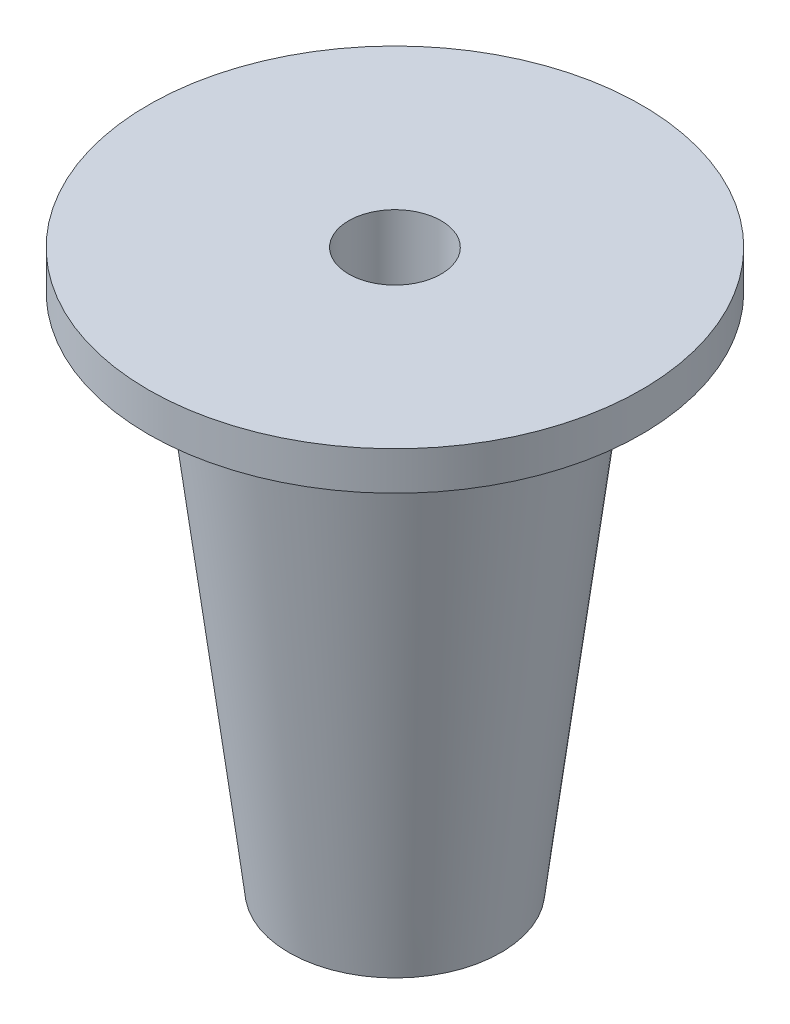
ISO-10303-21;
HEADER;
FILE_DESCRIPTION(('STEP AP214'),'2;1');
FILE_NAME('part.step','',(''),(''),'','','');
FILE_SCHEMA(('AUTOMOTIVE_DESIGN { 1 0 10303 214 1 1 1 1 }'));
ENDSEC;
DATA;
#1=APPLICATION_CONTEXT('core data for automotive mechanical design processes');
#2=APPLICATION_PROTOCOL_DEFINITION('international standard','automotive_design',2000,#1);
#3=PRODUCT_CONTEXT('',#1,'mechanical');
#4=PRODUCT('Part','Part','',(#3));
#5=PRODUCT_RELATED_PRODUCT_CATEGORY('part','',(#4));
#6=PRODUCT_DEFINITION_FORMATION('','',#4);
#7=PRODUCT_DEFINITION_CONTEXT('part definition',#1,'design');
#8=PRODUCT_DEFINITION('design','',#6,#7);
#9=PRODUCT_DEFINITION_SHAPE('','',#8);
#10=(LENGTH_UNIT() NAMED_UNIT(*) SI_UNIT(.MILLI.,.METRE.));
#11=(NAMED_UNIT(*) PLANE_ANGLE_UNIT() SI_UNIT($,.RADIAN.));
#12=(NAMED_UNIT(*) SI_UNIT($,.STERADIAN.) SOLID_ANGLE_UNIT());
#13=UNCERTAINTY_MEASURE_WITH_UNIT(LENGTH_MEASURE(1.E-05),#10,'distance_accuracy_value','');
#14=(GEOMETRIC_REPRESENTATION_CONTEXT(3) GLOBAL_UNCERTAINTY_ASSIGNED_CONTEXT((#13)) GLOBAL_UNIT_ASSIGNED_CONTEXT((#10,
#11,#12)) REPRESENTATION_CONTEXT('',''));
#15=CARTESIAN_POINT('',(0.,0.,0.));
#16=DIRECTION('',(0.,0.,1.));
#17=DIRECTION('',(1.,0.,0.));
#18=AXIS2_PLACEMENT_3D('',#15,#16,#17);
#19=CARTESIAN_POINT('',(0.,85.3656080302155,0.));
#20=DIRECTION('',(0.,1.,0.));
#21=DIRECTION('',(0.,0.,1.));
#22=AXIS2_PLACEMENT_3D('',#19,#20,#21);
#23=CYLINDRICAL_SURFACE('',#22,32.);
#24=CARTESIAN_POINT('',(0.,85.3656080302154,0.));
#25=DIRECTION('',(0.,1.,0.));
#26=DIRECTION('',(0.,0.,1.));
#27=AXIS2_PLACEMENT_3D('',#24,#25,#26);
#28=CIRCLE('',#27,32.);
#29=CARTESIAN_POINT('',(0.,85.3656080302154,32.));
#30=VERTEX_POINT('',#29);
#31=EDGE_CURVE('E10',#30,#30,#28,.T.);
#32=ORIENTED_EDGE('',*,*,#31,.F.);
#33=EDGE_LOOP('',(#32));
#34=FACE_BOUND('',#33,.T.);
#35=CARTESIAN_POINT('',(0.,80.3656080302154,0.));
#36=DIRECTION('',(0.,1.,0.));
#37=DIRECTION('',(0.,0.,1.));
#38=AXIS2_PLACEMENT_3D('',#35,#36,#37);
#39=CIRCLE('',#38,32.);
#40=CARTESIAN_POINT('',(0.,80.3656080302154,32.));
#41=VERTEX_POINT('',#40);
#42=EDGE_CURVE('E44',#41,#41,#39,.T.);
#43=ORIENTED_EDGE('',*,*,#42,.T.);
#44=EDGE_LOOP('',(#43));
#45=FACE_BOUND('',#44,.T.);
#46=ADVANCED_FACE('F30',(#34,#45),#23,.T.);
#47=CARTESIAN_POINT('',(32.,85.3656080302155,0.));
#48=DIRECTION('',(0.,-1.,0.));
#49=DIRECTION('',(0.,0.,-1.));
#50=AXIS2_PLACEMENT_3D('',#47,#48,#49);
#51=PLANE('',#50);
#52=CARTESIAN_POINT('',(0.,85.3656080302155,0.));
#53=DIRECTION('',(0.,1.,0.));
#54=DIRECTION('',(0.,0.,1.));
#55=AXIS2_PLACEMENT_3D('',#52,#53,#54);
#56=CIRCLE('',#55,6.);
#57=CARTESIAN_POINT('',(0.,85.3656080302155,6.));
#58=VERTEX_POINT('',#57);
#59=EDGE_CURVE('E50',#58,#58,#56,.T.);
#60=ORIENTED_EDGE('',*,*,#59,.F.);
#61=EDGE_LOOP('',(#60));
#62=FACE_BOUND('',#61,.T.);
#63=ORIENTED_EDGE('',*,*,#31,.T.);
#64=EDGE_LOOP('',(#63));
#65=FACE_BOUND('',#64,.T.);
#66=ADVANCED_FACE('F65',(#62,#65),#51,.F.);
#67=CARTESIAN_POINT('',(0.,13.,0.));
#68=DIRECTION('',(0.,1.,0.));
#69=DIRECTION('',(0.,0.,1.));
#70=AXIS2_PLACEMENT_3D('',#67,#68,#69);
#71=PLANE('',#70);
#72=CARTESIAN_POINT('',(0.,13.,0.));
#73=DIRECTION('',(0.,1.,0.));
#74=DIRECTION('',(0.,0.,1.));
#75=AXIS2_PLACEMENT_3D('',#72,#73,#74);
#76=CIRCLE('',#75,13.7509049431288);
#77=CARTESIAN_POINT('',(0.,13.,13.7509049431288));
#78=VERTEX_POINT('',#77);
#79=EDGE_CURVE('E36',#78,#78,#76,.T.);
#80=ORIENTED_EDGE('',*,*,#79,.F.);
#81=EDGE_LOOP('',(#80));
#82=FACE_BOUND('',#81,.T.);
#83=ADVANCED_FACE('F67',(#82),#71,.F.);
#84=CARTESIAN_POINT('',(0.,13.,0.));
#85=DIRECTION('',(0.,1.,0.));
#86=DIRECTION('',(0.,0.,1.));
#87=AXIS2_PLACEMENT_3D('',#84,#85,#86);
#88=CONICAL_SURFACE('',#87,13.7509049431288,0.122173047639603);
#89=CARTESIAN_POINT('',(0.,80.3656080302154,0.));
#90=DIRECTION('',(0.,1.,0.));
#91=DIRECTION('',(0.,0.,1.));
#92=AXIS2_PLACEMENT_3D('',#89,#90,#91);
#93=CIRCLE('',#92,22.022361545076);
#94=CARTESIAN_POINT('',(0.,80.3656080302154,22.022361545076));
#95=VERTEX_POINT('',#94);
#96=EDGE_CURVE('E40',#95,#95,#93,.T.);
#97=ORIENTED_EDGE('',*,*,#96,.F.);
#98=EDGE_LOOP('',(#97));
#99=FACE_BOUND('',#98,.T.);
#100=ORIENTED_EDGE('',*,*,#79,.T.);
#101=EDGE_LOOP('',(#100));
#102=FACE_BOUND('',#101,.T.);
#103=ADVANCED_FACE('F72',(#99,#102),#88,.T.);
#104=CARTESIAN_POINT('',(22.022361545076,80.3656080302154,0.));
#105=DIRECTION('',(0.,1.,0.));
#106=DIRECTION('',(0.,0.,1.));
#107=AXIS2_PLACEMENT_3D('',#104,#105,#106);
#108=PLANE('',#107);
#109=ORIENTED_EDGE('',*,*,#42,.F.);
#110=EDGE_LOOP('',(#109));
#111=FACE_BOUND('',#110,.T.);
#112=ORIENTED_EDGE('',*,*,#96,.T.);
#113=EDGE_LOOP('',(#112));
#114=FACE_BOUND('',#113,.T.);
#115=ADVANCED_FACE('F61',(#111,#114),#108,.F.);
#116=CARTESIAN_POINT('',(0.,65.3656080302154,0.));
#117=DIRECTION('',(0.,1.,0.));
#118=DIRECTION('',(0.,0.,1.));
#119=AXIS2_PLACEMENT_3D('',#116,#117,#118);
#120=CYLINDRICAL_SURFACE('',#119,6.);
#121=CARTESIAN_POINT('',(0.,65.3656080302154,0.));
#122=DIRECTION('',(0.,1.,0.));
#123=DIRECTION('',(0.,0.,1.));
#124=AXIS2_PLACEMENT_3D('',#121,#122,#123);
#125=CIRCLE('',#124,6.);
#126=CARTESIAN_POINT('',(0.,65.3656080302154,6.));
#127=VERTEX_POINT('',#126);
#128=EDGE_CURVE('E49',#127,#127,#125,.T.);
#129=ORIENTED_EDGE('',*,*,#128,.F.);
#130=EDGE_LOOP('',(#129));
#131=FACE_BOUND('',#130,.T.);
#132=ORIENTED_EDGE('',*,*,#59,.T.);
#133=EDGE_LOOP('',(#132));
#134=FACE_BOUND('',#133,.T.);
#135=ADVANCED_FACE('F58',(#131,#134),#120,.F.);
#136=CARTESIAN_POINT('',(0.,65.3656080302154,0.));
#137=DIRECTION('',(0.,1.,0.));
#138=DIRECTION('',(0.,0.,1.));
#139=AXIS2_PLACEMENT_3D('',#136,#137,#138);
#140=PLANE('',#139);
#141=ORIENTED_EDGE('',*,*,#128,.T.);
#142=EDGE_LOOP('',(#141));
#143=FACE_BOUND('',#142,.T.);
#144=ADVANCED_FACE('F56',(#143),#140,.T.);
#145=CLOSED_SHELL('',(#46,#66,#83,#103,#115,#135,#144));
#146=MANIFOLD_SOLID_BREP('B2',#145);
#147=ADVANCED_BREP_SHAPE_REPRESENTATION('',(#18,#146),#14);
#148=SHAPE_DEFINITION_REPRESENTATION(#9,#147);
ENDSEC;
END-ISO-10303-21;
